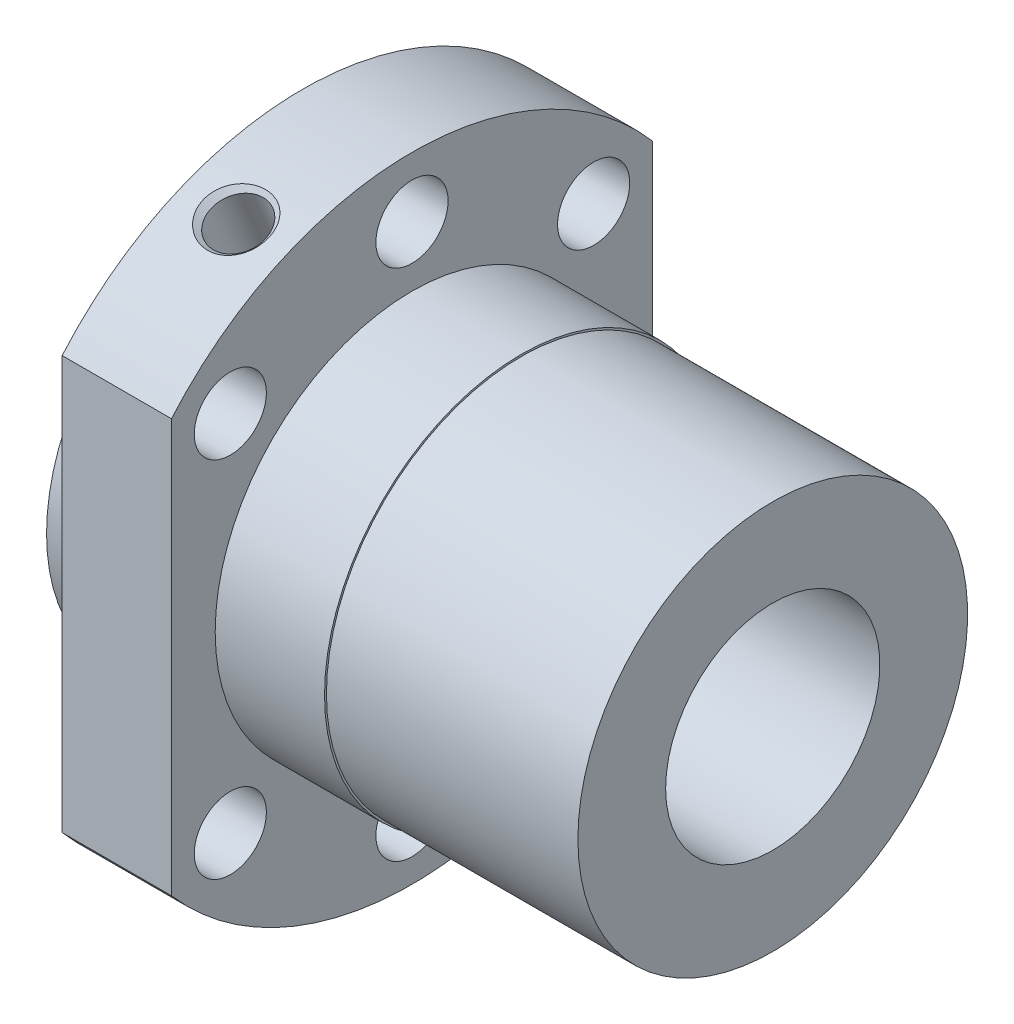
ISO-10303-21;
HEADER;
FILE_DESCRIPTION(('STEP AP214'),'2;1');
FILE_NAME('part.step','',(''),(''),'','','');
FILE_SCHEMA(('AUTOMOTIVE_DESIGN { 1 0 10303 214 1 1 1 1 }'));
ENDSEC;
DATA;
#1=APPLICATION_CONTEXT('core data for automotive mechanical design processes');
#2=APPLICATION_PROTOCOL_DEFINITION('international standard','automotive_design',2000,#1);
#3=PRODUCT_CONTEXT('',#1,'mechanical');
#4=PRODUCT('Part','Part','',(#3));
#5=PRODUCT_RELATED_PRODUCT_CATEGORY('part','',(#4));
#6=PRODUCT_DEFINITION_FORMATION('','',#4);
#7=PRODUCT_DEFINITION_CONTEXT('part definition',#1,'design');
#8=PRODUCT_DEFINITION('design','',#6,#7);
#9=PRODUCT_DEFINITION_SHAPE('','',#8);
#10=(LENGTH_UNIT() NAMED_UNIT(*) SI_UNIT(.MILLI.,.METRE.));
#11=(NAMED_UNIT(*) PLANE_ANGLE_UNIT() SI_UNIT($,.RADIAN.));
#12=(NAMED_UNIT(*) SI_UNIT($,.STERADIAN.) SOLID_ANGLE_UNIT());
#13=UNCERTAINTY_MEASURE_WITH_UNIT(LENGTH_MEASURE(1.E-05),#10,'distance_accuracy_value','');
#14=(GEOMETRIC_REPRESENTATION_CONTEXT(3) GLOBAL_UNCERTAINTY_ASSIGNED_CONTEXT((#13)) GLOBAL_UNIT_ASSIGNED_CONTEXT((#10,
#11,#12)) REPRESENTATION_CONTEXT('',''));
#15=CARTESIAN_POINT('',(0.,0.,0.));
#16=DIRECTION('',(0.,0.,1.));
#17=DIRECTION('',(1.,0.,0.));
#18=AXIS2_PLACEMENT_3D('',#15,#16,#17);
#19=CARTESIAN_POINT('',(0.,0.,0.));
#20=DIRECTION('',(-1.,0.,0.));
#21=DIRECTION('',(0.,0.,1.));
#22=AXIS2_PLACEMENT_3D('',#19,#20,#21);
#23=CYLINDRICAL_SURFACE('',#22,29.);
#24=CARTESIAN_POINT('',(-16.0471528051486,27.4418860529888,9.37778709103724));
#25=CARTESIAN_POINT('',(-15.9509794232949,27.4772458060399,9.27431537978984));
#26=CARTESIAN_POINT('',(-15.8465628444582,27.5096931734158,9.17744988958459));
#27=CARTESIAN_POINT('',(-15.623846155562,27.5686044264055,8.99893956429611));
#28=CARTESIAN_POINT('',(-15.5055325656888,27.5950624284346,8.91730970945831));
#29=CARTESIAN_POINT('',(-15.2399684382006,27.6453070175091,8.76040824817005));
#30=CARTESIAN_POINT('',(-15.0910015824717,27.6681658548033,8.68772875053844));
#31=CARTESIAN_POINT('',(-14.7827055269309,27.7060284830692,8.56621576812955));
#32=CARTESIAN_POINT('',(-14.6233732879783,27.7210299584791,8.517389313121));
#33=CARTESIAN_POINT('',(-14.2928120873945,27.7436464969821,8.44343817193164));
#34=CARTESIAN_POINT('',(-14.1213616244114,27.7509809190185,8.4192148820269));
#35=CARTESIAN_POINT('',(-13.7766334485058,27.7573574694737,8.39816807050523));
#36=CARTESIAN_POINT('',(-13.603355576114,27.7563988681185,8.40134696024003));
#37=CARTESIAN_POINT('',(-13.2568612944112,27.746096199131,8.43531070761668));
#38=CARTESIAN_POINT('',(-13.0836934153232,27.7366135400168,8.46655181883527));
#39=CARTESIAN_POINT('',(-12.7453386799775,27.7090005643355,8.5564877632999));
#40=CARTESIAN_POINT('',(-12.5801521229176,27.6908699238561,8.61518362486909));
#41=CARTESIAN_POINT('',(-12.2637037669352,27.6460146400988,8.75804886926572));
#42=CARTESIAN_POINT('',(-12.1123603849644,27.619345166713,8.84205452393516));
#43=CARTESIAN_POINT('',(-11.827200902804,27.5573466642658,9.03342249400712));
#44=CARTESIAN_POINT('',(-11.6933825039527,27.5220187726334,9.14078174131406));
#45=CARTESIAN_POINT('',(-11.4515816892472,27.4440457534132,9.37223439989992));
#46=CARTESIAN_POINT('',(-11.3429411984424,27.4016537607932,9.49572468566267));
#47=CARTESIAN_POINT('',(-11.1503825515934,27.3092853147307,9.75818778770878));
#48=CARTESIAN_POINT('',(-11.0664566102857,27.2593112572264,9.89715570937186));
#49=CARTESIAN_POINT('',(-10.9299944450424,27.1551921190256,10.179245316609));
#50=CARTESIAN_POINT('',(-10.8761464550098,27.1013617826686,10.3218486193974));
#51=CARTESIAN_POINT('',(-10.7959747614106,26.9887798382266,10.6127299401183));
#52=CARTESIAN_POINT('',(-10.7696428476723,26.9300297037522,10.7610062516579));
#53=CARTESIAN_POINT('',(-10.7460819421921,26.811792123469,11.0522152252083));
#54=CARTESIAN_POINT('',(-10.7476689459942,26.7524410010354,11.1951085965124));
#55=CARTESIAN_POINT('',(-10.7769934284818,26.6324568213707,11.4776213778959));
#56=CARTESIAN_POINT('',(-10.804728508667,26.5718238822163,11.6172410870567));
#57=CARTESIAN_POINT('',(-10.8848721660339,26.4518384367941,11.8878910359027));
#58=CARTESIAN_POINT('',(-10.9370210099095,26.3924791719862,12.0189955338695));
#59=CARTESIAN_POINT('',(-11.0640562617887,26.2763090904274,12.2708941937717));
#60=CARTESIAN_POINT('',(-11.1389449670074,26.2194985318166,12.3916873124557));
#61=CARTESIAN_POINT('',(-11.311313122517,26.1088030680805,12.623285491564));
#62=CARTESIAN_POINT('',(-11.4093432980593,26.0550370790197,12.7337369272245));
#63=CARTESIAN_POINT('',(-11.6237698481538,25.9539310470256,12.9385678872214));
#64=CARTESIAN_POINT('',(-11.7401700205066,25.9065923366365,13.0329440797654));
#65=CARTESIAN_POINT('',(-11.9938296404189,25.8178790469271,13.207846348654));
#66=CARTESIAN_POINT('',(-12.131808106486,25.7768849320533,13.287522639832));
#67=CARTESIAN_POINT('',(-12.4203608374357,25.7050900999692,13.4258868547121));
#68=CARTESIAN_POINT('',(-12.5709377717395,25.674291549929,13.4845703163903));
#69=CARTESIAN_POINT('',(-12.8873044994676,25.6228931184954,13.581993050391));
#70=CARTESIAN_POINT('',(-13.0534691457205,25.6027838402734,13.6197757215882));
#71=CARTESIAN_POINT('',(-13.390568377446,25.5755795365716,13.670792650843));
#72=CARTESIAN_POINT('',(-13.5615036689778,25.5684864479787,13.6840232554093));
#73=CARTESIAN_POINT('',(-13.907601591886,25.5675750084349,13.6857268195041));
#74=CARTESIAN_POINT('',(-14.0827684069663,25.5740752233981,13.6736056463369));
#75=CARTESIAN_POINT('',(-14.4283351590163,25.60074700114,13.623602458358));
#76=CARTESIAN_POINT('',(-14.598734799594,25.6209194120092,13.5857188454937));
#77=CARTESIAN_POINT('',(-14.9300306255438,25.6741711566528,13.484812799054));
#78=CARTESIAN_POINT('',(-15.0909160346594,25.707264814998,13.4217624637664));
#79=CARTESIAN_POINT('',(-15.3980866033506,25.785044365063,13.2717216724476));
#80=CARTESIAN_POINT('',(-15.544372743709,25.8297294773389,13.1847328260895));
#81=CARTESIAN_POINT('',(-15.8144794835272,25.9277671014432,12.9908580091969));
#82=CARTESIAN_POINT('',(-15.9387318942624,25.9809017099859,12.8844643528869));
#83=CARTESIAN_POINT('',(-16.1644274028008,26.0944229173692,12.6529702286032));
#84=CARTESIAN_POINT('',(-16.2658765530999,26.1548075853381,12.5278747392277));
#85=CARTESIAN_POINT('',(-16.4382334842358,26.2776277656337,12.268087975263));
#86=CARTESIAN_POINT('',(-16.5102873336148,26.3398565944132,12.1340598176751));
#87=CARTESIAN_POINT('',(-16.6272386551354,26.4663818801328,11.8555458110812));
#88=CARTESIAN_POINT('',(-16.6721458297219,26.5306775896894,11.7110637190945));
#89=CARTESIAN_POINT('',(-16.7315221071511,26.6559219422859,11.4230169296646));
#90=CARTESIAN_POINT('',(-16.7473349709394,26.7168845802905,11.2797342886988));
#91=CARTESIAN_POINT('',(-16.7520440004875,26.8366260901781,10.9918057314372));
#92=CARTESIAN_POINT('',(-16.7409405706909,26.8954049948603,10.8471598356581));
#93=CARTESIAN_POINT('',(-16.6928096507013,27.0078353420896,10.5640683264924));
#94=CARTESIAN_POINT('',(-16.6563652938959,27.0615718499286,10.4255563731172));
#95=CARTESIAN_POINT('',(-16.5595179022301,27.16412623737,10.155349024127));
#96=CARTESIAN_POINT('',(-16.499130826267,27.212947366168,10.0236491539202));
#97=CARTESIAN_POINT('',(-16.3754878596237,27.2926208766962,9.80421687510648));
#98=CARTESIAN_POINT('',(-16.3172480671549,27.3248030644719,9.71409297377834));
#99=CARTESIAN_POINT('',(-16.1900086170626,27.385857546719,9.54061075010385));
#100=CARTESIAN_POINT('',(-16.1210115714261,27.4147306417317,9.45725079284378));
#101=CARTESIAN_POINT('',(-16.0471528051486,27.4418860529888,9.37778709103724));
#102=B_SPLINE_CURVE_WITH_KNOTS('',3,(#24,#25,#26,#27,#28,#29,#30,#31,#32,#33,#34,#35,#36,#37,
#38,#39,#40,#41,#42,#43,#44,#45,#46,#47,#48,#49,#50,#51,#52,#53,#54,#55,#56,#57,#58,#59,#60,#61,
#62,#63,#64,#65,#66,#67,#68,#69,#70,#71,#72,#73,#74,#75,#76,#77,#78,#79,#80,#81,#82,#83,#84,#85,
#86,#87,#88,#89,#90,#91,#92,#93,#94,#95,#96,#97,#98,#99,#100,#101),.UNSPECIFIED.,.T.,.F.,(4,2,2,
2,2,2,2,2,2,2,2,2,2,2,2,2,2,2,2,2,2,2,2,2,2,2,2,2,2,2,2,2,2,2,2,2,2,2,4),(0.,0.436547245668665,
0.873521485377371,1.37318330272475,1.87299228751245,2.39051597244288,2.90808519916594,
3.43422481721063,3.9603841434981,4.48321029449928,5.00596780026528,5.51294168051616,
6.01975568903916,6.50227682684877,6.98465395017379,7.44662533143842,7.90855434130096,
8.36567692752376,8.82284570833265,9.29224400912664,9.76173948043736,10.2531015431874,
10.7445679829285,11.2569803944278,11.7694690497832,12.2941025760857,12.8187686485465,
13.3440180279786,13.869232097224,14.3826158191894,14.8958631162927,15.3865594891892,
15.8770803793151,16.3443151268429,16.8115428537581,17.2683601527395,17.7248734729921,
18.060212202299,18.3954696338818),.UNSPECIFIED.);
#103=CARTESIAN_POINT('',(-16.0471528051486,27.4418860529888,9.37778709103724));
#104=VERTEX_POINT('',#103);
#105=EDGE_CURVE('E106',#104,#104,#102,.T.);
#106=ORIENTED_EDGE('',*,*,#105,.T.);
#107=EDGE_LOOP('',(#106));
#108=FACE_BOUND('',#107,.T.);
#109=CARTESIAN_POINT('',(-8.75,0.,0.));
#110=DIRECTION('',(-1.,0.,0.));
#111=DIRECTION('',(0.,0.,1.));
#112=AXIS2_PLACEMENT_3D('',#109,#110,#111);
#113=CIRCLE('',#112,29.);
#114=CARTESIAN_POINT('',(-8.75,18.8944436276912,22.));
#115=VERTEX_POINT('',#114);
#116=CARTESIAN_POINT('',(-8.75,18.8944436276912,-22.));
#117=VERTEX_POINT('',#116);
#118=EDGE_CURVE('E70',#115,#117,#113,.T.);
#119=ORIENTED_EDGE('',*,*,#118,.T.);
#120=DIRECTION('',(-1.,0.,0.));
#121=VECTOR('',#120,1.);
#122=CARTESIAN_POINT('',(0.,18.8944436276912,-22.));
#123=LINE('',#122,#121);
#124=CARTESIAN_POINT('',(-18.75,18.8944436276912,-22.));
#125=VERTEX_POINT('',#124);
#126=EDGE_CURVE('E60',#117,#125,#123,.T.);
#127=ORIENTED_EDGE('',*,*,#126,.T.);
#128=CARTESIAN_POINT('',(-18.75,0.,0.));
#129=DIRECTION('',(-1.,0.,0.));
#130=DIRECTION('',(0.,0.,1.));
#131=AXIS2_PLACEMENT_3D('',#128,#129,#130);
#132=CIRCLE('',#131,29.);
#133=CARTESIAN_POINT('',(-18.75,18.8944436276912,22.));
#134=VERTEX_POINT('',#133);
#135=EDGE_CURVE('E68',#134,#125,#132,.T.);
#136=ORIENTED_EDGE('',*,*,#135,.F.);
#137=DIRECTION('',(-1.,0.,0.));
#138=VECTOR('',#137,1.);
#139=CARTESIAN_POINT('',(0.,18.8944436276912,22.));
#140=LINE('',#139,#138);
#141=EDGE_CURVE('E39',#134,#115,#140,.F.);
#142=ORIENTED_EDGE('',*,*,#141,.T.);
#143=EDGE_LOOP('',(#119,#127,#136,#142));
#144=FACE_BOUND('',#143,.T.);
#145=ADVANCED_FACE('F16',(#108,#144),#23,.T.);
#146=CARTESIAN_POINT('',(-24.25,17.925,0.));
#147=DIRECTION('',(1.,0.,0.));
#148=DIRECTION('',(0.,0.,-1.));
#149=AXIS2_PLACEMENT_3D('',#146,#147,#148);
#150=PLANE('',#149);
#151=CARTESIAN_POINT('',(-24.25,0.,0.));
#152=DIRECTION('',(1.,0.,0.));
#153=DIRECTION('',(0.,0.,-1.));
#154=AXIS2_PLACEMENT_3D('',#151,#152,#153);
#155=CIRCLE('',#154,9.8);
#156=CARTESIAN_POINT('',(-24.25,0.,-9.8));
#157=VERTEX_POINT('',#156);
#158=EDGE_CURVE('E168',#157,#157,#155,.T.);
#159=ORIENTED_EDGE('',*,*,#158,.T.);
#160=EDGE_LOOP('',(#159));
#161=FACE_BOUND('',#160,.T.);
#162=CARTESIAN_POINT('',(-24.25,0.,0.));
#163=DIRECTION('',(-1.,0.,0.));
#164=DIRECTION('',(0.,0.,1.));
#165=AXIS2_PLACEMENT_3D('',#162,#163,#164);
#166=CIRCLE('',#165,17.925);
#167=CARTESIAN_POINT('',(-24.25,0.,17.925));
#168=VERTEX_POINT('',#167);
#169=EDGE_CURVE('E171',#168,#168,#166,.T.);
#170=ORIENTED_EDGE('',*,*,#169,.T.);
#171=EDGE_LOOP('',(#170));
#172=FACE_BOUND('',#171,.T.);
#173=ADVANCED_FACE('F18',(#161,#172),#150,.F.);
#174=CARTESIAN_POINT('',(24.25,9.8,0.));
#175=DIRECTION('',(-1.,0.,0.));
#176=DIRECTION('',(0.,0.,1.));
#177=AXIS2_PLACEMENT_3D('',#174,#175,#176);
#178=PLANE('',#177);
#179=CARTESIAN_POINT('',(24.25,0.,0.));
#180=DIRECTION('',(-1.,0.,0.));
#181=DIRECTION('',(0.,0.,1.));
#182=AXIS2_PLACEMENT_3D('',#179,#180,#181);
#183=CIRCLE('',#182,9.8);
#184=CARTESIAN_POINT('',(24.25,0.,9.8));
#185=VERTEX_POINT('',#184);
#186=EDGE_CURVE('E178',#185,#185,#183,.T.);
#187=ORIENTED_EDGE('',*,*,#186,.T.);
#188=EDGE_LOOP('',(#187));
#189=FACE_BOUND('',#188,.T.);
#190=CARTESIAN_POINT('',(24.25,0.,0.));
#191=DIRECTION('',(-1.,0.,0.));
#192=DIRECTION('',(0.,0.,1.));
#193=AXIS2_PLACEMENT_3D('',#190,#191,#192);
#194=CIRCLE('',#193,17.825);
#195=CARTESIAN_POINT('',(24.25,0.,17.825));
#196=VERTEX_POINT('',#195);
#197=EDGE_CURVE('E102',#196,#196,#194,.T.);
#198=ORIENTED_EDGE('',*,*,#197,.F.);
#199=EDGE_LOOP('',(#198));
#200=FACE_BOUND('',#199,.T.);
#201=ADVANCED_FACE('F155',(#189,#200),#178,.F.);
#202=CARTESIAN_POINT('',(0.,0.,0.));
#203=DIRECTION('',(-1.,0.,0.));
#204=DIRECTION('',(0.,0.,1.));
#205=AXIS2_PLACEMENT_3D('',#202,#203,#204);
#206=CYLINDRICAL_SURFACE('',#205,17.825);
#207=CARTESIAN_POINT('',(1.25,0.,0.));
#208=DIRECTION('',(-1.,0.,0.));
#209=DIRECTION('',(0.,0.,1.));
#210=AXIS2_PLACEMENT_3D('',#207,#208,#209);
#211=CIRCLE('',#210,17.825);
#212=CARTESIAN_POINT('',(1.25,0.,17.825));
#213=VERTEX_POINT('',#212);
#214=EDGE_CURVE('E98',#213,#213,#211,.T.);
#215=ORIENTED_EDGE('',*,*,#214,.F.);
#216=EDGE_LOOP('',(#215));
#217=FACE_BOUND('',#216,.T.);
#218=ORIENTED_EDGE('',*,*,#197,.T.);
#219=EDGE_LOOP('',(#218));
#220=FACE_BOUND('',#219,.T.);
#221=ADVANCED_FACE('F162',(#217,#220),#206,.T.);
#222=CARTESIAN_POINT('',(1.25,17.825,0.));
#223=DIRECTION('',(-1.,0.,0.));
#224=DIRECTION('',(0.,0.,1.));
#225=AXIS2_PLACEMENT_3D('',#222,#223,#224);
#226=PLANE('',#225);
#227=CARTESIAN_POINT('',(1.25,0.,0.));
#228=DIRECTION('',(-1.,0.,0.));
#229=DIRECTION('',(0.,0.,1.));
#230=AXIS2_PLACEMENT_3D('',#227,#228,#229);
#231=CIRCLE('',#230,18.);
#232=CARTESIAN_POINT('',(1.25,0.,18.));
#233=VERTEX_POINT('',#232);
#234=EDGE_CURVE('E94',#233,#233,#231,.T.);
#235=ORIENTED_EDGE('',*,*,#234,.F.);
#236=EDGE_LOOP('',(#235));
#237=FACE_BOUND('',#236,.T.);
#238=ORIENTED_EDGE('',*,*,#214,.T.);
#239=EDGE_LOOP('',(#238));
#240=FACE_BOUND('',#239,.T.);
#241=ADVANCED_FACE('F439',(#237,#240),#226,.F.);
#242=CARTESIAN_POINT('',(0.,0.,0.));
#243=DIRECTION('',(-1.,0.,0.));
#244=DIRECTION('',(0.,0.,1.));
#245=AXIS2_PLACEMENT_3D('',#242,#243,#244);
#246=CYLINDRICAL_SURFACE('',#245,18.);
#247=CARTESIAN_POINT('',(-8.75,0.,0.));
#248=DIRECTION('',(-1.,0.,0.));
#249=DIRECTION('',(0.,0.,1.));
#250=AXIS2_PLACEMENT_3D('',#247,#248,#249);
#251=CIRCLE('',#250,18.);
#252=CARTESIAN_POINT('',(-8.75,0.,18.));
#253=VERTEX_POINT('',#252);
#254=EDGE_CURVE('E90',#253,#253,#251,.T.);
#255=ORIENTED_EDGE('',*,*,#254,.F.);
#256=EDGE_LOOP('',(#255));
#257=FACE_BOUND('',#256,.T.);
#258=ORIENTED_EDGE('',*,*,#234,.T.);
#259=EDGE_LOOP('',(#258));
#260=FACE_BOUND('',#259,.T.);
#261=ADVANCED_FACE('F269',(#257,#260),#246,.T.);
#262=CARTESIAN_POINT('',(-8.75,18.,0.));
#263=DIRECTION('',(-1.,0.,0.));
#264=DIRECTION('',(0.,0.,1.));
#265=AXIS2_PLACEMENT_3D('',#262,#263,#264);
#266=PLANE('',#265);
#267=CARTESIAN_POINT('',(-8.75,-16.6170093578838,-16.6170093578838));
#268=DIRECTION('',(-1.,0.,0.));
#269=DIRECTION('',(0.,0.,1.));
#270=AXIS2_PLACEMENT_3D('',#267,#268,#269);
#271=CIRCLE('',#270,3.3);
#272=CARTESIAN_POINT('',(-8.75,-16.6170093578838,-13.3170093578838));
#273=VERTEX_POINT('',#272);
#274=EDGE_CURVE('E216',#273,#273,#271,.T.);
#275=ORIENTED_EDGE('',*,*,#274,.T.);
#276=EDGE_LOOP('',(#275));
#277=FACE_BOUND('',#276,.T.);
#278=CARTESIAN_POINT('',(-8.75,-23.5,0.));
#279=DIRECTION('',(-1.,0.,0.));
#280=DIRECTION('',(0.,0.,1.));
#281=AXIS2_PLACEMENT_3D('',#278,#279,#280);
#282=CIRCLE('',#281,3.3);
#283=CARTESIAN_POINT('',(-8.75,-23.5,3.3));
#284=VERTEX_POINT('',#283);
#285=EDGE_CURVE('E211',#284,#284,#282,.T.);
#286=ORIENTED_EDGE('',*,*,#285,.T.);
#287=EDGE_LOOP('',(#286));
#288=FACE_BOUND('',#287,.T.);
#289=CARTESIAN_POINT('',(-8.75,-16.6170093578838,16.6170093578838));
#290=DIRECTION('',(-1.,0.,0.));
#291=DIRECTION('',(0.,0.,1.));
#292=AXIS2_PLACEMENT_3D('',#289,#290,#291);
#293=CIRCLE('',#292,3.3);
#294=CARTESIAN_POINT('',(-8.75,-16.6170093578838,19.9170093578838));
#295=VERTEX_POINT('',#294);
#296=EDGE_CURVE('E206',#295,#295,#293,.T.);
#297=ORIENTED_EDGE('',*,*,#296,.T.);
#298=EDGE_LOOP('',(#297));
#299=FACE_BOUND('',#298,.T.);
#300=CARTESIAN_POINT('',(-8.75,16.6170093578838,16.6170093578838));
#301=DIRECTION('',(-1.,0.,0.));
#302=DIRECTION('',(0.,0.,1.));
#303=AXIS2_PLACEMENT_3D('',#300,#301,#302);
#304=CIRCLE('',#303,3.3);
#305=CARTESIAN_POINT('',(-8.75,16.6170093578838,19.9170093578838));
#306=VERTEX_POINT('',#305);
#307=EDGE_CURVE('E201',#306,#306,#304,.T.);
#308=ORIENTED_EDGE('',*,*,#307,.T.);
#309=EDGE_LOOP('',(#308));
#310=FACE_BOUND('',#309,.T.);
#311=CARTESIAN_POINT('',(-8.75,23.5,0.));
#312=DIRECTION('',(-1.,0.,0.));
#313=DIRECTION('',(0.,0.,1.));
#314=AXIS2_PLACEMENT_3D('',#311,#312,#313);
#315=CIRCLE('',#314,3.3);
#316=CARTESIAN_POINT('',(-8.75,23.5,3.3));
#317=VERTEX_POINT('',#316);
#318=EDGE_CURVE('E196',#317,#317,#315,.T.);
#319=ORIENTED_EDGE('',*,*,#318,.T.);
#320=EDGE_LOOP('',(#319));
#321=FACE_BOUND('',#320,.T.);
#322=CARTESIAN_POINT('',(-8.75,16.6170093578838,-16.6170093578838));
#323=DIRECTION('',(-1.,0.,0.));
#324=DIRECTION('',(0.,0.,1.));
#325=AXIS2_PLACEMENT_3D('',#322,#323,#324);
#326=CIRCLE('',#325,3.3);
#327=CARTESIAN_POINT('',(-8.75,16.6170093578838,-13.3170093578838));
#328=VERTEX_POINT('',#327);
#329=EDGE_CURVE('E192',#328,#328,#326,.T.);
#330=ORIENTED_EDGE('',*,*,#329,.T.);
#331=EDGE_LOOP('',(#330));
#332=FACE_BOUND('',#331,.T.);
#333=CARTESIAN_POINT('',(-8.75,-18.8944436276912,-22.));
#334=VERTEX_POINT('',#333);
#335=CARTESIAN_POINT('',(-8.75,-18.8944436276912,22.));
#336=VERTEX_POINT('',#335);
#337=EDGE_CURVE('E76',#334,#336,#113,.T.);
#338=ORIENTED_EDGE('',*,*,#337,.F.);
#339=DIRECTION('',(0.,1.,0.));
#340=VECTOR('',#339,1.);
#341=CARTESIAN_POINT('',(-8.75,18.,-22.));
#342=LINE('',#341,#340);
#343=EDGE_CURVE('E72',#334,#117,#342,.T.);
#344=ORIENTED_EDGE('',*,*,#343,.T.);
#345=ORIENTED_EDGE('',*,*,#118,.F.);
#346=DIRECTION('',(0.,-1.,0.));
#347=VECTOR('',#346,1.);
#348=CARTESIAN_POINT('',(-8.75,18.,22.));
#349=LINE('',#348,#347);
#350=EDGE_CURVE('E221',#115,#336,#349,.T.);
#351=ORIENTED_EDGE('',*,*,#350,.T.);
#352=EDGE_LOOP('',(#338,#344,#345,#351));
#353=FACE_BOUND('',#352,.T.);
#354=ORIENTED_EDGE('',*,*,#254,.T.);
#355=EDGE_LOOP('',(#354));
#356=FACE_BOUND('',#355,.T.);
#357=ADVANCED_FACE('F146',(#277,#288,#299,#310,#321,#332,#353,#356),#266,.F.);
#358=CARTESIAN_POINT('',(-18.75,-18.8944436276912,-22.));
#359=VERTEX_POINT('',#358);
#360=CARTESIAN_POINT('',(-18.75,-18.8944436276912,22.));
#361=VERTEX_POINT('',#360);
#362=EDGE_CURVE('E77',#359,#361,#132,.T.);
#363=ORIENTED_EDGE('',*,*,#362,.F.);
#364=DIRECTION('',(-1.,0.,0.));
#365=VECTOR('',#364,1.);
#366=CARTESIAN_POINT('',(0.,-18.8944436276912,-22.));
#367=LINE('',#366,#365);
#368=EDGE_CURVE('E32',#359,#334,#367,.F.);
#369=ORIENTED_EDGE('',*,*,#368,.T.);
#370=ORIENTED_EDGE('',*,*,#337,.T.);
#371=DIRECTION('',(-1.,0.,0.));
#372=VECTOR('',#371,1.);
#373=CARTESIAN_POINT('',(0.,-18.8944436276912,22.));
#374=LINE('',#373,#372);
#375=EDGE_CURVE('E225',#336,#361,#374,.T.);
#376=ORIENTED_EDGE('',*,*,#375,.T.);
#377=EDGE_LOOP('',(#363,#369,#370,#376));
#378=FACE_BOUND('',#377,.T.);
#379=ADVANCED_FACE('F116',(#378),#23,.T.);
#380=CARTESIAN_POINT('',(-18.75,29.,0.));
#381=DIRECTION('',(1.,0.,0.));
#382=DIRECTION('',(0.,0.,-1.));
#383=AXIS2_PLACEMENT_3D('',#380,#381,#382);
#384=PLANE('',#383);
#385=CARTESIAN_POINT('',(-18.75,-16.6170093578838,-16.6170093578838));
#386=DIRECTION('',(1.,0.,0.));
#387=DIRECTION('',(0.,0.,-1.));
#388=AXIS2_PLACEMENT_3D('',#385,#386,#387);
#389=CIRCLE('',#388,3.3);
#390=CARTESIAN_POINT('',(-18.75,-16.6170093578838,-19.9170093578838));
#391=VERTEX_POINT('',#390);
#392=EDGE_CURVE('E220',#391,#391,#389,.T.);
#393=ORIENTED_EDGE('',*,*,#392,.T.);
#394=EDGE_LOOP('',(#393));
#395=FACE_BOUND('',#394,.T.);
#396=CARTESIAN_POINT('',(-18.75,-23.5,0.));
#397=DIRECTION('',(1.,0.,0.));
#398=DIRECTION('',(0.,0.,-1.));
#399=AXIS2_PLACEMENT_3D('',#396,#397,#398);
#400=CIRCLE('',#399,3.3);
#401=CARTESIAN_POINT('',(-18.75,-23.5,-3.3));
#402=VERTEX_POINT('',#401);
#403=EDGE_CURVE('E215',#402,#402,#400,.T.);
#404=ORIENTED_EDGE('',*,*,#403,.T.);
#405=EDGE_LOOP('',(#404));
#406=FACE_BOUND('',#405,.T.);
#407=CARTESIAN_POINT('',(-18.75,-16.6170093578838,16.6170093578838));
#408=DIRECTION('',(1.,0.,0.));
#409=DIRECTION('',(0.,0.,-1.));
#410=AXIS2_PLACEMENT_3D('',#407,#408,#409);
#411=CIRCLE('',#410,3.3);
#412=CARTESIAN_POINT('',(-18.75,-16.6170093578838,13.3170093578838));
#413=VERTEX_POINT('',#412);
#414=EDGE_CURVE('E210',#413,#413,#411,.T.);
#415=ORIENTED_EDGE('',*,*,#414,.T.);
#416=EDGE_LOOP('',(#415));
#417=FACE_BOUND('',#416,.T.);
#418=CARTESIAN_POINT('',(-18.75,16.6170093578838,16.6170093578838));
#419=DIRECTION('',(1.,0.,0.));
#420=DIRECTION('',(0.,0.,-1.));
#421=AXIS2_PLACEMENT_3D('',#418,#419,#420);
#422=CIRCLE('',#421,3.3);
#423=CARTESIAN_POINT('',(-18.75,16.6170093578838,13.3170093578838));
#424=VERTEX_POINT('',#423);
#425=EDGE_CURVE('E205',#424,#424,#422,.T.);
#426=ORIENTED_EDGE('',*,*,#425,.T.);
#427=EDGE_LOOP('',(#426));
#428=FACE_BOUND('',#427,.T.);
#429=CARTESIAN_POINT('',(-18.75,23.5,0.));
#430=DIRECTION('',(1.,0.,0.));
#431=DIRECTION('',(0.,0.,-1.));
#432=AXIS2_PLACEMENT_3D('',#429,#430,#431);
#433=CIRCLE('',#432,3.3);
#434=CARTESIAN_POINT('',(-18.75,23.5,-3.3));
#435=VERTEX_POINT('',#434);
#436=EDGE_CURVE('E200',#435,#435,#433,.T.);
#437=ORIENTED_EDGE('',*,*,#436,.T.);
#438=EDGE_LOOP('',(#437));
#439=FACE_BOUND('',#438,.T.);
#440=CARTESIAN_POINT('',(-18.75,16.6170093578838,-16.6170093578838));
#441=DIRECTION('',(1.,0.,0.));
#442=DIRECTION('',(0.,0.,-1.));
#443=AXIS2_PLACEMENT_3D('',#440,#441,#442);
#444=CIRCLE('',#443,3.3);
#445=CARTESIAN_POINT('',(-18.75,16.6170093578838,-19.9170093578838));
#446=VERTEX_POINT('',#445);
#447=EDGE_CURVE('E114',#446,#446,#444,.T.);
#448=ORIENTED_EDGE('',*,*,#447,.T.);
#449=EDGE_LOOP('',(#448));
#450=FACE_BOUND('',#449,.T.);
#451=CARTESIAN_POINT('',(-18.75,0.,0.));
#452=DIRECTION('',(-1.,0.,0.));
#453=DIRECTION('',(0.,0.,1.));
#454=AXIS2_PLACEMENT_3D('',#451,#452,#453);
#455=CIRCLE('',#454,17.925);
#456=CARTESIAN_POINT('',(-18.75,0.,17.925));
#457=VERTEX_POINT('',#456);
#458=EDGE_CURVE('E85',#457,#457,#455,.T.);
#459=ORIENTED_EDGE('',*,*,#458,.F.);
#460=EDGE_LOOP('',(#459));
#461=FACE_BOUND('',#460,.T.);
#462=ORIENTED_EDGE('',*,*,#135,.T.);
#463=DIRECTION('',(0.,-1.,0.));
#464=VECTOR('',#463,1.);
#465=CARTESIAN_POINT('',(-18.75,29.,-22.));
#466=LINE('',#465,#464);
#467=EDGE_CURVE('E11',#125,#359,#466,.T.);
#468=ORIENTED_EDGE('',*,*,#467,.T.);
#469=ORIENTED_EDGE('',*,*,#362,.T.);
#470=DIRECTION('',(0.,1.,0.));
#471=VECTOR('',#470,1.);
#472=CARTESIAN_POINT('',(-18.75,29.,22.));
#473=LINE('',#472,#471);
#474=EDGE_CURVE('E25',#361,#134,#473,.T.);
#475=ORIENTED_EDGE('',*,*,#474,.T.);
#476=EDGE_LOOP('',(#462,#468,#469,#475));
#477=FACE_BOUND('',#476,.T.);
#478=ADVANCED_FACE('F74',(#395,#406,#417,#428,#439,#450,#461,#477),#384,.F.);
#479=CARTESIAN_POINT('',(0.,0.,0.));
#480=DIRECTION('',(-1.,0.,0.));
#481=DIRECTION('',(0.,0.,1.));
#482=AXIS2_PLACEMENT_3D('',#479,#480,#481);
#483=CYLINDRICAL_SURFACE('',#482,17.925);
#484=ORIENTED_EDGE('',*,*,#169,.F.);
#485=EDGE_LOOP('',(#484));
#486=FACE_BOUND('',#485,.T.);
#487=ORIENTED_EDGE('',*,*,#458,.T.);
#488=EDGE_LOOP('',(#487));
#489=FACE_BOUND('',#488,.T.);
#490=ADVANCED_FACE('F137',(#486,#489),#483,.T.);
#491=CARTESIAN_POINT('',(0.,0.,0.));
#492=DIRECTION('',(-1.,0.,0.));
#493=DIRECTION('',(0.,0.,1.));
#494=AXIS2_PLACEMENT_3D('',#491,#492,#493);
#495=CYLINDRICAL_SURFACE('',#494,9.8);
#496=ORIENTED_EDGE('',*,*,#158,.F.);
#497=EDGE_LOOP('',(#496));
#498=FACE_BOUND('',#497,.T.);
#499=ORIENTED_EDGE('',*,*,#186,.F.);
#500=EDGE_LOOP('',(#499));
#501=FACE_BOUND('',#500,.T.);
#502=ADVANCED_FACE('F126',(#498,#501),#495,.F.);
#503=CARTESIAN_POINT('',(-13.75,26.2924566458556,10.89069213082));
#504=DIRECTION('',(0.,0.923879532511287,0.38268343236509));
#505=DIRECTION('',(0.,-0.38268343236509,0.923879532511287));
#506=AXIS2_PLACEMENT_3D('',#503,#504,#505);
#507=CONICAL_SURFACE('',#506,2.45875,0.785398163397449);
#508=CARTESIAN_POINT('',(-13.75,26.2924566458556,10.89069213082));
#509=DIRECTION('',(0.,-0.923879532511287,-0.38268343236509));
#510=DIRECTION('',(0.,0.38268343236509,-0.923879532511287));
#511=AXIS2_PLACEMENT_3D('',#508,#509,#510);
#512=CIRCLE('',#511,2.45875);
#513=CARTESIAN_POINT('',(-13.75,27.2333795351833,8.61910333025788));
#514=VERTEX_POINT('',#513);
#515=EDGE_CURVE('E188',#514,#514,#512,.T.);
#516=ORIENTED_EDGE('',*,*,#515,.T.);
#517=EDGE_LOOP('',(#516));
#518=FACE_BOUND('',#517,.T.);
#519=ORIENTED_EDGE('',*,*,#105,.F.);
#520=EDGE_LOOP('',(#519));
#521=FACE_BOUND('',#520,.T.);
#522=ADVANCED_FACE('F120',(#518,#521),#507,.F.);
#523=CARTESIAN_POINT('',(-13.75,19.401470182737,8.03635207966689));
#524=DIRECTION('',(0.,0.923879532511287,0.38268343236509));
#525=DIRECTION('',(0.,-0.38268343236509,0.923879532511287));
#526=AXIS2_PLACEMENT_3D('',#523,#524,#525);
#527=CONICAL_SURFACE('',#526,2.45875,1.0471975511966);
#528=CARTESIAN_POINT('',(-13.75,18.0899677772444,7.49310999622688));
#529=VERTEX_POINT('',#528);
#530=VERTEX_LOOP('',#529);
#531=FACE_BOUND('',#530,.T.);
#532=CARTESIAN_POINT('',(-13.75,19.401470182737,8.03635207966689));
#533=DIRECTION('',(0.,-0.923879532511287,-0.38268343236509));
#534=DIRECTION('',(0.,0.38268343236509,-0.923879532511287));
#535=AXIS2_PLACEMENT_3D('',#532,#533,#534);
#536=CIRCLE('',#535,2.45875);
#537=CARTESIAN_POINT('',(-13.75,20.3423930720647,5.76476327910476));
#538=VERTEX_POINT('',#537);
#539=EDGE_CURVE('E184',#538,#538,#536,.T.);
#540=ORIENTED_EDGE('',*,*,#539,.F.);
#541=EDGE_LOOP('',(#540));
#542=FACE_BOUND('',#541,.T.);
#543=ADVANCED_FACE('F125',(#531,#542),#527,.F.);
#544=CARTESIAN_POINT('',(-13.75,27.7163859753386,11.4805029709527));
#545=DIRECTION('',(0.,-0.923879532511287,-0.38268343236509));
#546=DIRECTION('',(0.,0.38268343236509,-0.923879532511287));
#547=AXIS2_PLACEMENT_3D('',#544,#545,#546);
#548=CYLINDRICAL_SURFACE('',#547,2.45875);
#549=ORIENTED_EDGE('',*,*,#515,.F.);
#550=EDGE_LOOP('',(#549));
#551=FACE_BOUND('',#550,.T.);
#552=ORIENTED_EDGE('',*,*,#539,.T.);
#553=EDGE_LOOP('',(#552));
#554=FACE_BOUND('',#553,.T.);
#555=ADVANCED_FACE('F130',(#551,#554),#548,.F.);
#556=CARTESIAN_POINT('',(-24.25,16.6170093578838,-16.6170093578838));
#557=DIRECTION('',(1.,0.,0.));
#558=DIRECTION('',(0.,-0.707106781186548,0.707106781186548));
#559=AXIS2_PLACEMENT_3D('',#556,#557,#558);
#560=CYLINDRICAL_SURFACE('',#559,3.3);
#561=ORIENTED_EDGE('',*,*,#447,.F.);
#562=EDGE_LOOP('',(#561));
#563=FACE_BOUND('',#562,.T.);
#564=ORIENTED_EDGE('',*,*,#329,.F.);
#565=EDGE_LOOP('',(#564));
#566=FACE_BOUND('',#565,.T.);
#567=ADVANCED_FACE('F128',(#563,#566),#560,.F.);
#568=CARTESIAN_POINT('',(-24.25,23.5,0.));
#569=DIRECTION('',(1.,0.,0.));
#570=DIRECTION('',(0.,-1.,0.));
#571=AXIS2_PLACEMENT_3D('',#568,#569,#570);
#572=CYLINDRICAL_SURFACE('',#571,3.3);
#573=ORIENTED_EDGE('',*,*,#436,.F.);
#574=EDGE_LOOP('',(#573));
#575=FACE_BOUND('',#574,.T.);
#576=ORIENTED_EDGE('',*,*,#318,.F.);
#577=EDGE_LOOP('',(#576));
#578=FACE_BOUND('',#577,.T.);
#579=ADVANCED_FACE('F261',(#575,#578),#572,.F.);
#580=CARTESIAN_POINT('',(-24.25,16.6170093578838,16.6170093578838));
#581=DIRECTION('',(1.,0.,0.));
#582=DIRECTION('',(0.,-0.707106781186548,-0.707106781186548));
#583=AXIS2_PLACEMENT_3D('',#580,#581,#582);
#584=CYLINDRICAL_SURFACE('',#583,3.3);
#585=ORIENTED_EDGE('',*,*,#425,.F.);
#586=EDGE_LOOP('',(#585));
#587=FACE_BOUND('',#586,.T.);
#588=ORIENTED_EDGE('',*,*,#307,.F.);
#589=EDGE_LOOP('',(#588));
#590=FACE_BOUND('',#589,.T.);
#591=ADVANCED_FACE('F264',(#587,#590),#584,.F.);
#592=CARTESIAN_POINT('',(-24.25,-16.6170093578838,16.6170093578838));
#593=DIRECTION('',(1.,0.,0.));
#594=DIRECTION('',(0.,0.707106781186548,-0.707106781186548));
#595=AXIS2_PLACEMENT_3D('',#592,#593,#594);
#596=CYLINDRICAL_SURFACE('',#595,3.3);
#597=ORIENTED_EDGE('',*,*,#414,.F.);
#598=EDGE_LOOP('',(#597));
#599=FACE_BOUND('',#598,.T.);
#600=ORIENTED_EDGE('',*,*,#296,.F.);
#601=EDGE_LOOP('',(#600));
#602=FACE_BOUND('',#601,.T.);
#603=ADVANCED_FACE('F301',(#599,#602),#596,.F.);
#604=CARTESIAN_POINT('',(-24.25,-23.5,0.));
#605=DIRECTION('',(1.,0.,0.));
#606=DIRECTION('',(0.,1.,0.));
#607=AXIS2_PLACEMENT_3D('',#604,#605,#606);
#608=CYLINDRICAL_SURFACE('',#607,3.3);
#609=ORIENTED_EDGE('',*,*,#403,.F.);
#610=EDGE_LOOP('',(#609));
#611=FACE_BOUND('',#610,.T.);
#612=ORIENTED_EDGE('',*,*,#285,.F.);
#613=EDGE_LOOP('',(#612));
#614=FACE_BOUND('',#613,.T.);
#615=ADVANCED_FACE('F309',(#611,#614),#608,.F.);
#616=CARTESIAN_POINT('',(-24.25,-16.6170093578838,-16.6170093578838));
#617=DIRECTION('',(1.,0.,0.));
#618=DIRECTION('',(0.,0.707106781186548,0.707106781186547));
#619=AXIS2_PLACEMENT_3D('',#616,#617,#618);
#620=CYLINDRICAL_SURFACE('',#619,3.3);
#621=ORIENTED_EDGE('',*,*,#392,.F.);
#622=EDGE_LOOP('',(#621));
#623=FACE_BOUND('',#622,.T.);
#624=ORIENTED_EDGE('',*,*,#274,.F.);
#625=EDGE_LOOP('',(#624));
#626=FACE_BOUND('',#625,.T.);
#627=ADVANCED_FACE('F317',(#623,#626),#620,.F.);
#628=CARTESIAN_POINT('',(0.,0.,22.));
#629=DIRECTION('',(0.,0.,-1.));
#630=DIRECTION('',(-1.,0.,0.));
#631=AXIS2_PLACEMENT_3D('',#628,#629,#630);
#632=PLANE('',#631);
#633=ORIENTED_EDGE('',*,*,#141,.F.);
#634=ORIENTED_EDGE('',*,*,#474,.F.);
#635=ORIENTED_EDGE('',*,*,#375,.F.);
#636=ORIENTED_EDGE('',*,*,#350,.F.);
#637=EDGE_LOOP('',(#633,#634,#635,#636));
#638=FACE_BOUND('',#637,.T.);
#639=ADVANCED_FACE('F238',(#638),#632,.F.);
#640=CARTESIAN_POINT('',(0.,0.,-22.));
#641=DIRECTION('',(0.,0.,1.));
#642=DIRECTION('',(-1.,0.,0.));
#643=AXIS2_PLACEMENT_3D('',#640,#641,#642);
#644=PLANE('',#643);
#645=ORIENTED_EDGE('',*,*,#368,.F.);
#646=ORIENTED_EDGE('',*,*,#467,.F.);
#647=ORIENTED_EDGE('',*,*,#126,.F.);
#648=ORIENTED_EDGE('',*,*,#343,.F.);
#649=EDGE_LOOP('',(#645,#646,#647,#648));
#650=FACE_BOUND('',#649,.T.);
#651=ADVANCED_FACE('F59',(#650),#644,.F.);
#652=CLOSED_SHELL('',(#145,#173,#201,#221,#241,#261,#357,#379,#478,#490,#502,#522,#543,#555,
#567,#579,#591,#603,#615,#627,#639,#651));
#653=MANIFOLD_SOLID_BREP('B1',#652);
#654=ADVANCED_BREP_SHAPE_REPRESENTATION('',(#18,#653),#14);
#655=SHAPE_DEFINITION_REPRESENTATION(#9,#654);
ENDSEC;
END-ISO-10303-21;
